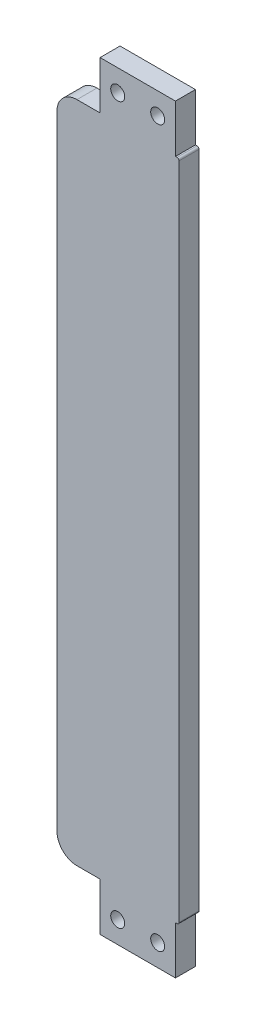
ISO-10303-21;
HEADER;
FILE_DESCRIPTION(('STEP AP214'),'2;1');
FILE_NAME('part.step','',(''),(''),'','','');
FILE_SCHEMA(('AUTOMOTIVE_DESIGN { 1 0 10303 214 1 1 1 1 }'));
ENDSEC;
DATA;
#1=APPLICATION_CONTEXT('core data for automotive mechanical design processes');
#2=APPLICATION_PROTOCOL_DEFINITION('international standard','automotive_design',2000,#1);
#3=PRODUCT_CONTEXT('',#1,'mechanical');
#4=PRODUCT('Part','Part','',(#3));
#5=PRODUCT_RELATED_PRODUCT_CATEGORY('part','',(#4));
#6=PRODUCT_DEFINITION_FORMATION('','',#4);
#7=PRODUCT_DEFINITION_CONTEXT('part definition',#1,'design');
#8=PRODUCT_DEFINITION('design','',#6,#7);
#9=PRODUCT_DEFINITION_SHAPE('','',#8);
#10=(LENGTH_UNIT() NAMED_UNIT(*) SI_UNIT(.MILLI.,.METRE.));
#11=(NAMED_UNIT(*) PLANE_ANGLE_UNIT() SI_UNIT($,.RADIAN.));
#12=(NAMED_UNIT(*) SI_UNIT($,.STERADIAN.) SOLID_ANGLE_UNIT());
#13=UNCERTAINTY_MEASURE_WITH_UNIT(LENGTH_MEASURE(1.E-05),#10,'distance_accuracy_value','');
#14=(GEOMETRIC_REPRESENTATION_CONTEXT(3) GLOBAL_UNCERTAINTY_ASSIGNED_CONTEXT((#13)) GLOBAL_UNIT_ASSIGNED_CONTEXT((#10,
#11,#12)) REPRESENTATION_CONTEXT('',''));
#15=CARTESIAN_POINT('',(0.,0.,0.));
#16=DIRECTION('',(0.,0.,1.));
#17=DIRECTION('',(1.,0.,0.));
#18=AXIS2_PLACEMENT_3D('',#15,#16,#17);
#19=CARTESIAN_POINT('',(9.84658159851318,-15.5,5.));
#20=DIRECTION('',(0.,0.,-1.));
#21=DIRECTION('',(-1.,0.,0.));
#22=AXIS2_PLACEMENT_3D('',#19,#20,#21);
#23=PLANE('',#22);
#24=CARTESIAN_POINT('',(9.84658159851318,-15.5,5.));
#25=DIRECTION('',(0.,0.,1.));
#26=DIRECTION('',(-1.,0.,0.));
#27=AXIS2_PLACEMENT_3D('',#24,#25,#26);
#28=CIRCLE('',#27,0.5);
#29=CARTESIAN_POINT('',(10.3465815985132,-15.5,5.));
#30=VERTEX_POINT('',#29);
#31=CARTESIAN_POINT('',(9.84658159851317,-15.,5.));
#32=VERTEX_POINT('',#31);
#33=EDGE_CURVE('E240',#30,#32,#28,.T.);
#34=ORIENTED_EDGE('',*,*,#33,.T.);
#35=DIRECTION('',(-1.,0.,0.));
#36=VECTOR('',#35,1.);
#37=CARTESIAN_POINT('',(9.44658159851318,-15.,5.));
#38=LINE('',#37,#36);
#39=CARTESIAN_POINT('',(9.44658159851318,-15.,5.));
#40=VERTEX_POINT('',#39);
#41=EDGE_CURVE('E128',#32,#40,#38,.T.);
#42=ORIENTED_EDGE('',*,*,#41,.T.);
#43=DIRECTION('',(0.,1.,0.));
#44=VECTOR('',#43,1.);
#45=CARTESIAN_POINT('',(9.44658159851318,-15.,5.));
#46=LINE('',#45,#44);
#47=CARTESIAN_POINT('',(9.44658159851314,-2.99999999999996,5.));
#48=VERTEX_POINT('',#47);
#49=EDGE_CURVE('E293',#40,#48,#46,.T.);
#50=ORIENTED_EDGE('',*,*,#49,.T.);
#51=DIRECTION('',(-1.,0.,0.));
#52=VECTOR('',#51,1.);
#53=CARTESIAN_POINT('',(9.44658159851314,-2.99999999999996,5.));
#54=LINE('',#53,#52);
#55=CARTESIAN_POINT('',(-9.413759597102,-2.99999999999998,5.));
#56=VERTEX_POINT('',#55);
#57=EDGE_CURVE('E313',#48,#56,#54,.T.);
#58=ORIENTED_EDGE('',*,*,#57,.T.);
#59=DIRECTION('',(0.,-1.,0.));
#60=VECTOR('',#59,1.);
#61=CARTESIAN_POINT('',(-9.413759597102,-2.99999999999998,5.));
#62=LINE('',#61,#60);
#63=CARTESIAN_POINT('',(-9.41375959710199,-15.,5.));
#64=VERTEX_POINT('',#63);
#65=EDGE_CURVE('E309',#56,#64,#62,.T.);
#66=ORIENTED_EDGE('',*,*,#65,.T.);
#67=DIRECTION('',(-1.,0.,0.));
#68=VECTOR('',#67,1.);
#69=CARTESIAN_POINT('',(-9.41375959710199,-15.,5.));
#70=LINE('',#69,#68);
#71=CARTESIAN_POINT('',(-15.1941363117714,-15.,5.));
#72=VERTEX_POINT('',#71);
#73=EDGE_CURVE('E312',#64,#72,#70,.T.);
#74=ORIENTED_EDGE('',*,*,#73,.T.);
#75=CARTESIAN_POINT('',(-15.1941363117714,-20.,5.));
#76=DIRECTION('',(0.,0.,1.));
#77=DIRECTION('',(1.,0.,0.));
#78=AXIS2_PLACEMENT_3D('',#75,#76,#77);
#79=CIRCLE('',#78,5.);
#80=CARTESIAN_POINT('',(-20.1941363117715,-20.,5.));
#81=VERTEX_POINT('',#80);
#82=EDGE_CURVE('E317',#72,#81,#79,.T.);
#83=ORIENTED_EDGE('',*,*,#82,.T.);
#84=DIRECTION('',(0.,-1.,0.));
#85=VECTOR('',#84,1.);
#86=CARTESIAN_POINT('',(-20.1941363117715,-20.,5.));
#87=LINE('',#86,#85);
#88=CARTESIAN_POINT('',(-20.1941363117714,-176.,5.));
#89=VERTEX_POINT('',#88);
#90=EDGE_CURVE('E324',#81,#89,#87,.T.);
#91=ORIENTED_EDGE('',*,*,#90,.T.);
#92=CARTESIAN_POINT('',(-15.1941363117714,-176.,5.));
#93=DIRECTION('',(0.,0.,1.));
#94=DIRECTION('',(-1.,0.,0.));
#95=AXIS2_PLACEMENT_3D('',#92,#93,#94);
#96=CIRCLE('',#95,5.);
#97=CARTESIAN_POINT('',(-15.1941363117714,-181.,5.));
#98=VERTEX_POINT('',#97);
#99=EDGE_CURVE('E327',#89,#98,#96,.T.);
#100=ORIENTED_EDGE('',*,*,#99,.T.);
#101=DIRECTION('',(1.,0.,0.));
#102=VECTOR('',#101,1.);
#103=CARTESIAN_POINT('',(-9.44658159851322,-181.,5.));
#104=LINE('',#103,#102);
#105=CARTESIAN_POINT('',(-9.44658159851322,-181.,5.));
#106=VERTEX_POINT('',#105);
#107=EDGE_CURVE('E330',#98,#106,#104,.T.);
#108=ORIENTED_EDGE('',*,*,#107,.T.);
#109=DIRECTION('',(0.,-1.,0.));
#110=VECTOR('',#109,1.);
#111=CARTESIAN_POINT('',(-9.44658159851322,-181.,5.));
#112=LINE('',#111,#110);
#113=CARTESIAN_POINT('',(-9.44658159851322,-193.,5.));
#114=VERTEX_POINT('',#113);
#115=EDGE_CURVE('E333',#106,#114,#112,.T.);
#116=ORIENTED_EDGE('',*,*,#115,.T.);
#117=DIRECTION('',(1.,0.,0.));
#118=VECTOR('',#117,1.);
#119=CARTESIAN_POINT('',(-9.44658159851322,-193.,5.));
#120=LINE('',#119,#118);
#121=CARTESIAN_POINT('',(9.4465815985132,-193.,5.));
#122=VERTEX_POINT('',#121);
#123=EDGE_CURVE('E336',#114,#122,#120,.T.);
#124=ORIENTED_EDGE('',*,*,#123,.T.);
#125=DIRECTION('',(0.,1.,0.));
#126=VECTOR('',#125,1.);
#127=CARTESIAN_POINT('',(9.4465815985132,-193.,5.));
#128=LINE('',#127,#126);
#129=CARTESIAN_POINT('',(9.4465815985132,-181.,5.));
#130=VERTEX_POINT('',#129);
#131=EDGE_CURVE('E171',#122,#130,#128,.T.);
#132=ORIENTED_EDGE('',*,*,#131,.T.);
#133=DIRECTION('',(1.,0.,0.));
#134=VECTOR('',#133,1.);
#135=CARTESIAN_POINT('',(9.84658159851319,-181.,5.));
#136=LINE('',#135,#134);
#137=CARTESIAN_POINT('',(9.84658159851319,-181.,5.));
#138=VERTEX_POINT('',#137);
#139=EDGE_CURVE('E165',#130,#138,#136,.T.);
#140=ORIENTED_EDGE('',*,*,#139,.T.);
#141=CARTESIAN_POINT('',(9.8465815985132,-180.5,5.));
#142=DIRECTION('',(0.,0.,1.));
#143=DIRECTION('',(-1.,0.,0.));
#144=AXIS2_PLACEMENT_3D('',#141,#142,#143);
#145=CIRCLE('',#144,0.5);
#146=CARTESIAN_POINT('',(10.3465815985132,-180.5,5.));
#147=VERTEX_POINT('',#146);
#148=EDGE_CURVE('E169',#138,#147,#145,.T.);
#149=ORIENTED_EDGE('',*,*,#148,.T.);
#150=DIRECTION('',(0.,1.,0.));
#151=VECTOR('',#150,1.);
#152=CARTESIAN_POINT('',(10.3465815985132,-15.5,5.));
#153=LINE('',#152,#151);
#154=EDGE_CURVE('E61',#147,#30,#153,.T.);
#155=ORIENTED_EDGE('',*,*,#154,.T.);
#156=EDGE_LOOP('',(#34,#42,#50,#58,#66,#74,#83,#91,#100,#108,#116,#124,#132,#140,#149,#155));
#157=FACE_BOUND('',#156,.T.);
#158=CARTESIAN_POINT('',(-4.99999999999996,-8.42970227866071,5.));
#159=DIRECTION('',(0.,0.,1.));
#160=DIRECTION('',(1.,0.,0.));
#161=AXIS2_PLACEMENT_3D('',#158,#159,#160);
#162=CIRCLE('',#161,1.75);
#163=CARTESIAN_POINT('',(-3.24999999999996,-8.42970227866071,5.));
#164=VERTEX_POINT('',#163);
#165=EDGE_CURVE('E198',#164,#164,#162,.T.);
#166=ORIENTED_EDGE('',*,*,#165,.F.);
#167=EDGE_LOOP('',(#166));
#168=FACE_BOUND('',#167,.T.);
#169=CARTESIAN_POINT('',(-5.00000000000012,-187.570297721339,5.));
#170=DIRECTION('',(0.,0.,1.));
#171=DIRECTION('',(1.,0.,0.));
#172=AXIS2_PLACEMENT_3D('',#169,#170,#171);
#173=CIRCLE('',#172,1.75);
#174=CARTESIAN_POINT('',(-3.25000000000012,-187.570297721339,5.));
#175=VERTEX_POINT('',#174);
#176=EDGE_CURVE('E406',#175,#175,#173,.T.);
#177=ORIENTED_EDGE('',*,*,#176,.F.);
#178=EDGE_LOOP('',(#177));
#179=FACE_BOUND('',#178,.T.);
#180=CARTESIAN_POINT('',(5.00000000000004,-8.42970227866071,5.));
#181=DIRECTION('',(0.,0.,1.));
#182=DIRECTION('',(1.,0.,0.));
#183=AXIS2_PLACEMENT_3D('',#180,#181,#182);
#184=CIRCLE('',#183,1.75);
#185=CARTESIAN_POINT('',(6.75000000000004,-8.42970227866071,5.));
#186=VERTEX_POINT('',#185);
#187=EDGE_CURVE('E398',#186,#186,#184,.T.);
#188=ORIENTED_EDGE('',*,*,#187,.F.);
#189=EDGE_LOOP('',(#188));
#190=FACE_BOUND('',#189,.T.);
#191=CARTESIAN_POINT('',(4.99999999999988,-187.570297721339,5.));
#192=DIRECTION('',(0.,0.,1.));
#193=DIRECTION('',(1.,0.,0.));
#194=AXIS2_PLACEMENT_3D('',#191,#192,#193);
#195=CIRCLE('',#194,1.75);
#196=CARTESIAN_POINT('',(6.74999999999988,-187.570297721339,5.));
#197=VERTEX_POINT('',#196);
#198=EDGE_CURVE('E387',#197,#197,#195,.T.);
#199=ORIENTED_EDGE('',*,*,#198,.F.);
#200=EDGE_LOOP('',(#199));
#201=FACE_BOUND('',#200,.T.);
#202=ADVANCED_FACE('F43',(#157,#168,#179,#190,#201),#23,.F.);
#203=CARTESIAN_POINT('',(9.84658159851318,-15.5,0.));
#204=DIRECTION('',(0.,0.,-1.));
#205=DIRECTION('',(-1.,0.,0.));
#206=AXIS2_PLACEMENT_3D('',#203,#204,#205);
#207=PLANE('',#206);
#208=CARTESIAN_POINT('',(5.00000000000004,-8.42970227866071,0.));
#209=DIRECTION('',(0.,0.,1.));
#210=DIRECTION('',(1.,0.,0.));
#211=AXIS2_PLACEMENT_3D('',#208,#209,#210);
#212=CIRCLE('',#211,1.75);
#213=CARTESIAN_POINT('',(6.75000000000004,-8.42970227866071,0.));
#214=VERTEX_POINT('',#213);
#215=EDGE_CURVE('E395',#214,#214,#212,.T.);
#216=ORIENTED_EDGE('',*,*,#215,.T.);
#217=EDGE_LOOP('',(#216));
#218=FACE_BOUND('',#217,.T.);
#219=CARTESIAN_POINT('',(-4.99999999999996,-8.42970227866071,0.));
#220=DIRECTION('',(0.,0.,1.));
#221=DIRECTION('',(1.,0.,0.));
#222=AXIS2_PLACEMENT_3D('',#219,#220,#221);
#223=CIRCLE('',#222,1.75);
#224=CARTESIAN_POINT('',(-3.24999999999996,-8.42970227866071,0.));
#225=VERTEX_POINT('',#224);
#226=EDGE_CURVE('E410',#225,#225,#223,.T.);
#227=ORIENTED_EDGE('',*,*,#226,.T.);
#228=EDGE_LOOP('',(#227));
#229=FACE_BOUND('',#228,.T.);
#230=CARTESIAN_POINT('',(9.84658159851318,-15.5,0.));
#231=DIRECTION('',(0.,0.,1.));
#232=DIRECTION('',(-1.,0.,0.));
#233=AXIS2_PLACEMENT_3D('',#230,#231,#232);
#234=CIRCLE('',#233,0.5);
#235=CARTESIAN_POINT('',(10.3465815985132,-15.5,0.));
#236=VERTEX_POINT('',#235);
#237=CARTESIAN_POINT('',(9.84658159851317,-15.,0.));
#238=VERTEX_POINT('',#237);
#239=EDGE_CURVE('E193',#236,#238,#234,.T.);
#240=ORIENTED_EDGE('',*,*,#239,.F.);
#241=DIRECTION('',(0.,1.,0.));
#242=VECTOR('',#241,1.);
#243=CARTESIAN_POINT('',(10.3465815985132,-15.5,0.));
#244=LINE('',#243,#242);
#245=CARTESIAN_POINT('',(10.3465815985132,-180.5,0.));
#246=VERTEX_POINT('',#245);
#247=EDGE_CURVE('E120',#246,#236,#244,.T.);
#248=ORIENTED_EDGE('',*,*,#247,.F.);
#249=CARTESIAN_POINT('',(9.8465815985132,-180.5,0.));
#250=DIRECTION('',(0.,0.,1.));
#251=DIRECTION('',(-1.,0.,0.));
#252=AXIS2_PLACEMENT_3D('',#249,#250,#251);
#253=CIRCLE('',#252,0.5);
#254=CARTESIAN_POINT('',(9.84658159851319,-181.,0.));
#255=VERTEX_POINT('',#254);
#256=EDGE_CURVE('E114',#255,#246,#253,.T.);
#257=ORIENTED_EDGE('',*,*,#256,.F.);
#258=DIRECTION('',(1.,0.,0.));
#259=VECTOR('',#258,1.);
#260=CARTESIAN_POINT('',(9.84658159851319,-181.,0.));
#261=LINE('',#260,#259);
#262=CARTESIAN_POINT('',(9.4465815985132,-181.,0.));
#263=VERTEX_POINT('',#262);
#264=EDGE_CURVE('E180',#263,#255,#261,.T.);
#265=ORIENTED_EDGE('',*,*,#264,.F.);
#266=DIRECTION('',(0.,1.,0.));
#267=VECTOR('',#266,1.);
#268=CARTESIAN_POINT('',(9.4465815985132,-193.,0.));
#269=LINE('',#268,#267);
#270=CARTESIAN_POINT('',(9.4465815985132,-193.,0.));
#271=VERTEX_POINT('',#270);
#272=EDGE_CURVE('E231',#271,#263,#269,.T.);
#273=ORIENTED_EDGE('',*,*,#272,.F.);
#274=DIRECTION('',(1.,0.,0.));
#275=VECTOR('',#274,1.);
#276=CARTESIAN_POINT('',(-9.44658159851322,-193.,0.));
#277=LINE('',#276,#275);
#278=CARTESIAN_POINT('',(-9.44658159851322,-193.,0.));
#279=VERTEX_POINT('',#278);
#280=EDGE_CURVE('E228',#279,#271,#277,.T.);
#281=ORIENTED_EDGE('',*,*,#280,.F.);
#282=DIRECTION('',(0.,-1.,0.));
#283=VECTOR('',#282,1.);
#284=CARTESIAN_POINT('',(-9.44658159851322,-181.,0.));
#285=LINE('',#284,#283);
#286=CARTESIAN_POINT('',(-9.44658159851322,-181.,0.));
#287=VERTEX_POINT('',#286);
#288=EDGE_CURVE('E225',#287,#279,#285,.T.);
#289=ORIENTED_EDGE('',*,*,#288,.F.);
#290=DIRECTION('',(1.,0.,0.));
#291=VECTOR('',#290,1.);
#292=CARTESIAN_POINT('',(-9.44658159851322,-181.,0.));
#293=LINE('',#292,#291);
#294=CARTESIAN_POINT('',(-15.1941363117714,-181.,0.));
#295=VERTEX_POINT('',#294);
#296=EDGE_CURVE('E222',#295,#287,#293,.T.);
#297=ORIENTED_EDGE('',*,*,#296,.F.);
#298=CARTESIAN_POINT('',(-15.1941363117714,-176.,0.));
#299=DIRECTION('',(0.,0.,1.));
#300=DIRECTION('',(-1.,0.,0.));
#301=AXIS2_PLACEMENT_3D('',#298,#299,#300);
#302=CIRCLE('',#301,5.);
#303=CARTESIAN_POINT('',(-20.1941363117714,-176.,0.));
#304=VERTEX_POINT('',#303);
#305=EDGE_CURVE('E219',#304,#295,#302,.T.);
#306=ORIENTED_EDGE('',*,*,#305,.F.);
#307=DIRECTION('',(0.,-1.,0.));
#308=VECTOR('',#307,1.);
#309=CARTESIAN_POINT('',(-20.1941363117715,-20.,0.));
#310=LINE('',#309,#308);
#311=CARTESIAN_POINT('',(-20.1941363117715,-20.,0.));
#312=VERTEX_POINT('',#311);
#313=EDGE_CURVE('E216',#312,#304,#310,.T.);
#314=ORIENTED_EDGE('',*,*,#313,.F.);
#315=CARTESIAN_POINT('',(-15.1941363117714,-20.,0.));
#316=DIRECTION('',(0.,0.,1.));
#317=DIRECTION('',(1.,0.,0.));
#318=AXIS2_PLACEMENT_3D('',#315,#316,#317);
#319=CIRCLE('',#318,5.);
#320=CARTESIAN_POINT('',(-15.1941363117714,-15.,0.));
#321=VERTEX_POINT('',#320);
#322=EDGE_CURVE('E213',#321,#312,#319,.T.);
#323=ORIENTED_EDGE('',*,*,#322,.F.);
#324=DIRECTION('',(-1.,0.,0.));
#325=VECTOR('',#324,1.);
#326=CARTESIAN_POINT('',(-9.41375959710199,-15.,0.));
#327=LINE('',#326,#325);
#328=CARTESIAN_POINT('',(-9.41375959710199,-15.,0.));
#329=VERTEX_POINT('',#328);
#330=EDGE_CURVE('E210',#329,#321,#327,.T.);
#331=ORIENTED_EDGE('',*,*,#330,.F.);
#332=DIRECTION('',(0.,-1.,0.));
#333=VECTOR('',#332,1.);
#334=CARTESIAN_POINT('',(-9.413759597102,-2.99999999999998,0.));
#335=LINE('',#334,#333);
#336=CARTESIAN_POINT('',(-9.413759597102,-2.99999999999998,0.));
#337=VERTEX_POINT('',#336);
#338=EDGE_CURVE('E207',#337,#329,#335,.T.);
#339=ORIENTED_EDGE('',*,*,#338,.F.);
#340=DIRECTION('',(-1.,0.,0.));
#341=VECTOR('',#340,1.);
#342=CARTESIAN_POINT('',(9.44658159851314,-2.99999999999996,0.));
#343=LINE('',#342,#341);
#344=CARTESIAN_POINT('',(9.44658159851314,-2.99999999999996,0.));
#345=VERTEX_POINT('',#344);
#346=EDGE_CURVE('E204',#345,#337,#343,.T.);
#347=ORIENTED_EDGE('',*,*,#346,.F.);
#348=DIRECTION('',(0.,1.,0.));
#349=VECTOR('',#348,1.);
#350=CARTESIAN_POINT('',(9.44658159851318,-15.,0.));
#351=LINE('',#350,#349);
#352=CARTESIAN_POINT('',(9.44658159851318,-15.,0.));
#353=VERTEX_POINT('',#352);
#354=EDGE_CURVE('E201',#353,#345,#351,.T.);
#355=ORIENTED_EDGE('',*,*,#354,.F.);
#356=DIRECTION('',(-1.,0.,0.));
#357=VECTOR('',#356,1.);
#358=CARTESIAN_POINT('',(9.44658159851318,-15.,0.));
#359=LINE('',#358,#357);
#360=EDGE_CURVE('E197',#238,#353,#359,.T.);
#361=ORIENTED_EDGE('',*,*,#360,.F.);
#362=EDGE_LOOP('',(#240,#248,#257,#265,#273,#281,#289,#297,#306,#314,#323,#331,#339,#347,#355,#361));
#363=FACE_BOUND('',#362,.T.);
#364=CARTESIAN_POINT('',(-5.00000000000012,-187.570297721339,0.));
#365=DIRECTION('',(0.,0.,1.));
#366=DIRECTION('',(1.,0.,0.));
#367=AXIS2_PLACEMENT_3D('',#364,#365,#366);
#368=CIRCLE('',#367,1.75);
#369=CARTESIAN_POINT('',(-3.25000000000012,-187.570297721339,0.));
#370=VERTEX_POINT('',#369);
#371=EDGE_CURVE('E402',#370,#370,#368,.T.);
#372=ORIENTED_EDGE('',*,*,#371,.T.);
#373=EDGE_LOOP('',(#372));
#374=FACE_BOUND('',#373,.T.);
#375=CARTESIAN_POINT('',(4.99999999999988,-187.570297721339,0.));
#376=DIRECTION('',(0.,0.,1.));
#377=DIRECTION('',(1.,0.,0.));
#378=AXIS2_PLACEMENT_3D('',#375,#376,#377);
#379=CIRCLE('',#378,1.75);
#380=CARTESIAN_POINT('',(6.74999999999988,-187.570297721339,0.));
#381=VERTEX_POINT('',#380);
#382=EDGE_CURVE('E390',#381,#381,#379,.T.);
#383=ORIENTED_EDGE('',*,*,#382,.T.);
#384=EDGE_LOOP('',(#383));
#385=FACE_BOUND('',#384,.T.);
#386=ADVANCED_FACE('F297',(#218,#229,#363,#374,#385),#207,.T.);
#387=CARTESIAN_POINT('',(9.84658159851318,-15.5,5.));
#388=DIRECTION('',(0.,0.,-1.));
#389=DIRECTION('',(-1.,0.,0.));
#390=AXIS2_PLACEMENT_3D('',#387,#388,#389);
#391=CYLINDRICAL_SURFACE('',#390,0.5);
#392=ORIENTED_EDGE('',*,*,#239,.T.);
#393=DIRECTION('',(0.,0.,-1.));
#394=VECTOR('',#393,1.);
#395=CARTESIAN_POINT('',(9.84658159851317,-15.,5.));
#396=LINE('',#395,#394);
#397=EDGE_CURVE('E11',#32,#238,#396,.T.);
#398=ORIENTED_EDGE('',*,*,#397,.F.);
#399=ORIENTED_EDGE('',*,*,#33,.F.);
#400=DIRECTION('',(0.,0.,-1.));
#401=VECTOR('',#400,1.);
#402=CARTESIAN_POINT('',(10.3465815985132,-15.5,5.));
#403=LINE('',#402,#401);
#404=EDGE_CURVE('E189',#30,#236,#403,.T.);
#405=ORIENTED_EDGE('',*,*,#404,.T.);
#406=EDGE_LOOP('',(#392,#398,#399,#405));
#407=FACE_BOUND('',#406,.T.);
#408=ADVANCED_FACE('F45',(#407),#391,.T.);
#409=CARTESIAN_POINT('',(9.44658159851318,-15.,5.));
#410=DIRECTION('',(0.,-1.,0.));
#411=DIRECTION('',(0.,0.,-1.));
#412=AXIS2_PLACEMENT_3D('',#409,#410,#411);
#413=PLANE('',#412);
#414=ORIENTED_EDGE('',*,*,#360,.T.);
#415=DIRECTION('',(0.,0.,-1.));
#416=VECTOR('',#415,1.);
#417=CARTESIAN_POINT('',(9.44658159851318,-15.,5.));
#418=LINE('',#417,#416);
#419=EDGE_CURVE('E53',#40,#353,#418,.T.);
#420=ORIENTED_EDGE('',*,*,#419,.F.);
#421=ORIENTED_EDGE('',*,*,#41,.F.);
#422=ORIENTED_EDGE('',*,*,#397,.T.);
#423=EDGE_LOOP('',(#414,#420,#421,#422));
#424=FACE_BOUND('',#423,.T.);
#425=ADVANCED_FACE('F582',(#424),#413,.F.);
#426=CARTESIAN_POINT('',(9.44658159851318,-15.,5.));
#427=DIRECTION('',(-1.,0.,0.));
#428=DIRECTION('',(0.,-1.,0.));
#429=AXIS2_PLACEMENT_3D('',#426,#427,#428);
#430=PLANE('',#429);
#431=ORIENTED_EDGE('',*,*,#354,.T.);
#432=DIRECTION('',(0.,0.,-1.));
#433=VECTOR('',#432,1.);
#434=CARTESIAN_POINT('',(9.44658159851314,-2.99999999999996,5.));
#435=LINE('',#434,#433);
#436=EDGE_CURVE('E283',#48,#345,#435,.T.);
#437=ORIENTED_EDGE('',*,*,#436,.F.);
#438=ORIENTED_EDGE('',*,*,#49,.F.);
#439=ORIENTED_EDGE('',*,*,#419,.T.);
#440=EDGE_LOOP('',(#431,#437,#438,#439));
#441=FACE_BOUND('',#440,.T.);
#442=ADVANCED_FACE('F291',(#441),#430,.F.);
#443=CARTESIAN_POINT('',(9.44658159851314,-2.99999999999996,5.));
#444=DIRECTION('',(0.,-1.,0.));
#445=DIRECTION('',(1.,0.,0.));
#446=AXIS2_PLACEMENT_3D('',#443,#444,#445);
#447=PLANE('',#446);
#448=ORIENTED_EDGE('',*,*,#346,.T.);
#449=DIRECTION('',(0.,0.,-1.));
#450=VECTOR('',#449,1.);
#451=CARTESIAN_POINT('',(-9.413759597102,-2.99999999999998,5.));
#452=LINE('',#451,#450);
#453=EDGE_CURVE('E279',#56,#337,#452,.T.);
#454=ORIENTED_EDGE('',*,*,#453,.F.);
#455=ORIENTED_EDGE('',*,*,#57,.F.);
#456=ORIENTED_EDGE('',*,*,#436,.T.);
#457=EDGE_LOOP('',(#448,#454,#455,#456));
#458=FACE_BOUND('',#457,.T.);
#459=ADVANCED_FACE('F303',(#458),#447,.F.);
#460=CARTESIAN_POINT('',(-9.413759597102,-2.99999999999998,5.));
#461=DIRECTION('',(1.,0.,0.));
#462=DIRECTION('',(0.,1.,0.));
#463=AXIS2_PLACEMENT_3D('',#460,#461,#462);
#464=PLANE('',#463);
#465=ORIENTED_EDGE('',*,*,#338,.T.);
#466=DIRECTION('',(0.,0.,-1.));
#467=VECTOR('',#466,1.);
#468=CARTESIAN_POINT('',(-9.41375959710199,-15.,5.));
#469=LINE('',#468,#467);
#470=EDGE_CURVE('E275',#64,#329,#469,.T.);
#471=ORIENTED_EDGE('',*,*,#470,.F.);
#472=ORIENTED_EDGE('',*,*,#65,.F.);
#473=ORIENTED_EDGE('',*,*,#453,.T.);
#474=EDGE_LOOP('',(#465,#471,#472,#473));
#475=FACE_BOUND('',#474,.T.);
#476=ADVANCED_FACE('F307',(#475),#464,.F.);
#477=CARTESIAN_POINT('',(-9.41375959710199,-15.,5.));
#478=DIRECTION('',(0.,-1.,0.));
#479=DIRECTION('',(0.,0.,-1.));
#480=AXIS2_PLACEMENT_3D('',#477,#478,#479);
#481=PLANE('',#480);
#482=ORIENTED_EDGE('',*,*,#330,.T.);
#483=DIRECTION('',(0.,0.,-1.));
#484=VECTOR('',#483,1.);
#485=CARTESIAN_POINT('',(-15.1941363117714,-15.,5.));
#486=LINE('',#485,#484);
#487=EDGE_CURVE('E271',#72,#321,#486,.T.);
#488=ORIENTED_EDGE('',*,*,#487,.F.);
#489=ORIENTED_EDGE('',*,*,#73,.F.);
#490=ORIENTED_EDGE('',*,*,#470,.T.);
#491=EDGE_LOOP('',(#482,#488,#489,#490));
#492=FACE_BOUND('',#491,.T.);
#493=ADVANCED_FACE('F543',(#492),#481,.F.);
#494=CARTESIAN_POINT('',(-15.1941363117714,-20.,5.));
#495=DIRECTION('',(0.,0.,-1.));
#496=DIRECTION('',(-1.,0.,0.));
#497=AXIS2_PLACEMENT_3D('',#494,#495,#496);
#498=CYLINDRICAL_SURFACE('',#497,5.);
#499=ORIENTED_EDGE('',*,*,#322,.T.);
#500=DIRECTION('',(0.,0.,-1.));
#501=VECTOR('',#500,1.);
#502=CARTESIAN_POINT('',(-20.1941363117715,-20.,5.));
#503=LINE('',#502,#501);
#504=EDGE_CURVE('E267',#81,#312,#503,.T.);
#505=ORIENTED_EDGE('',*,*,#504,.F.);
#506=ORIENTED_EDGE('',*,*,#82,.F.);
#507=ORIENTED_EDGE('',*,*,#487,.T.);
#508=EDGE_LOOP('',(#499,#505,#506,#507));
#509=FACE_BOUND('',#508,.T.);
#510=ADVANCED_FACE('F532',(#509),#498,.T.);
#511=CARTESIAN_POINT('',(-20.1941363117715,-20.,5.));
#512=DIRECTION('',(1.,0.,0.));
#513=DIRECTION('',(0.,1.,0.));
#514=AXIS2_PLACEMENT_3D('',#511,#512,#513);
#515=PLANE('',#514);
#516=ORIENTED_EDGE('',*,*,#313,.T.);
#517=DIRECTION('',(0.,0.,-1.));
#518=VECTOR('',#517,1.);
#519=CARTESIAN_POINT('',(-20.1941363117714,-176.,5.));
#520=LINE('',#519,#518);
#521=EDGE_CURVE('E263',#89,#304,#520,.T.);
#522=ORIENTED_EDGE('',*,*,#521,.F.);
#523=ORIENTED_EDGE('',*,*,#90,.F.);
#524=ORIENTED_EDGE('',*,*,#504,.T.);
#525=EDGE_LOOP('',(#516,#522,#523,#524));
#526=FACE_BOUND('',#525,.T.);
#527=ADVANCED_FACE('F521',(#526),#515,.F.);
#528=CARTESIAN_POINT('',(-15.1941363117714,-176.,5.));
#529=DIRECTION('',(0.,0.,-1.));
#530=DIRECTION('',(-1.,0.,0.));
#531=AXIS2_PLACEMENT_3D('',#528,#529,#530);
#532=CYLINDRICAL_SURFACE('',#531,5.);
#533=ORIENTED_EDGE('',*,*,#305,.T.);
#534=DIRECTION('',(0.,0.,-1.));
#535=VECTOR('',#534,1.);
#536=CARTESIAN_POINT('',(-15.1941363117714,-181.,5.));
#537=LINE('',#536,#535);
#538=EDGE_CURVE('E259',#98,#295,#537,.T.);
#539=ORIENTED_EDGE('',*,*,#538,.F.);
#540=ORIENTED_EDGE('',*,*,#99,.F.);
#541=ORIENTED_EDGE('',*,*,#521,.T.);
#542=EDGE_LOOP('',(#533,#539,#540,#541));
#543=FACE_BOUND('',#542,.T.);
#544=ADVANCED_FACE('F510',(#543),#532,.T.);
#545=CARTESIAN_POINT('',(-9.44658159851322,-181.,5.));
#546=DIRECTION('',(0.,1.,0.));
#547=DIRECTION('',(-1.,0.,0.));
#548=AXIS2_PLACEMENT_3D('',#545,#546,#547);
#549=PLANE('',#548);
#550=ORIENTED_EDGE('',*,*,#296,.T.);
#551=DIRECTION('',(0.,0.,-1.));
#552=VECTOR('',#551,1.);
#553=CARTESIAN_POINT('',(-9.44658159851322,-181.,5.));
#554=LINE('',#553,#552);
#555=EDGE_CURVE('E255',#106,#287,#554,.T.);
#556=ORIENTED_EDGE('',*,*,#555,.F.);
#557=ORIENTED_EDGE('',*,*,#107,.F.);
#558=ORIENTED_EDGE('',*,*,#538,.T.);
#559=EDGE_LOOP('',(#550,#556,#557,#558));
#560=FACE_BOUND('',#559,.T.);
#561=ADVANCED_FACE('F499',(#560),#549,.F.);
#562=CARTESIAN_POINT('',(-9.44658159851322,-181.,5.));
#563=DIRECTION('',(1.,0.,0.));
#564=DIRECTION('',(0.,1.,0.));
#565=AXIS2_PLACEMENT_3D('',#562,#563,#564);
#566=PLANE('',#565);
#567=ORIENTED_EDGE('',*,*,#288,.T.);
#568=DIRECTION('',(0.,0.,-1.));
#569=VECTOR('',#568,1.);
#570=CARTESIAN_POINT('',(-9.44658159851322,-193.,5.));
#571=LINE('',#570,#569);
#572=EDGE_CURVE('E251',#114,#279,#571,.T.);
#573=ORIENTED_EDGE('',*,*,#572,.F.);
#574=ORIENTED_EDGE('',*,*,#115,.F.);
#575=ORIENTED_EDGE('',*,*,#555,.T.);
#576=EDGE_LOOP('',(#567,#573,#574,#575));
#577=FACE_BOUND('',#576,.T.);
#578=ADVANCED_FACE('F489',(#577),#566,.F.);
#579=CARTESIAN_POINT('',(-9.44658159851322,-193.,5.));
#580=DIRECTION('',(0.,1.,0.));
#581=DIRECTION('',(0.,0.,1.));
#582=AXIS2_PLACEMENT_3D('',#579,#580,#581);
#583=PLANE('',#582);
#584=ORIENTED_EDGE('',*,*,#280,.T.);
#585=DIRECTION('',(0.,0.,-1.));
#586=VECTOR('',#585,1.);
#587=CARTESIAN_POINT('',(9.4465815985132,-193.,5.));
#588=LINE('',#587,#586);
#589=EDGE_CURVE('E247',#122,#271,#588,.T.);
#590=ORIENTED_EDGE('',*,*,#589,.F.);
#591=ORIENTED_EDGE('',*,*,#123,.F.);
#592=ORIENTED_EDGE('',*,*,#572,.T.);
#593=EDGE_LOOP('',(#584,#590,#591,#592));
#594=FACE_BOUND('',#593,.T.);
#595=ADVANCED_FACE('F344',(#594),#583,.F.);
#596=CARTESIAN_POINT('',(9.4465815985132,-193.,5.));
#597=DIRECTION('',(-1.,0.,0.));
#598=DIRECTION('',(0.,-1.,0.));
#599=AXIS2_PLACEMENT_3D('',#596,#597,#598);
#600=PLANE('',#599);
#601=ORIENTED_EDGE('',*,*,#272,.T.);
#602=DIRECTION('',(0.,0.,-1.));
#603=VECTOR('',#602,1.);
#604=CARTESIAN_POINT('',(9.4465815985132,-181.,5.));
#605=LINE('',#604,#603);
#606=EDGE_CURVE('E182',#130,#263,#605,.T.);
#607=ORIENTED_EDGE('',*,*,#606,.F.);
#608=ORIENTED_EDGE('',*,*,#131,.F.);
#609=ORIENTED_EDGE('',*,*,#589,.T.);
#610=EDGE_LOOP('',(#601,#607,#608,#609));
#611=FACE_BOUND('',#610,.T.);
#612=ADVANCED_FACE('F348',(#611),#600,.F.);
#613=CARTESIAN_POINT('',(9.84658159851319,-181.,5.));
#614=DIRECTION('',(0.,1.,0.));
#615=DIRECTION('',(0.,0.,1.));
#616=AXIS2_PLACEMENT_3D('',#613,#614,#615);
#617=PLANE('',#616);
#618=ORIENTED_EDGE('',*,*,#264,.T.);
#619=DIRECTION('',(0.,0.,-1.));
#620=VECTOR('',#619,1.);
#621=CARTESIAN_POINT('',(9.84658159851319,-181.,5.));
#622=LINE('',#621,#620);
#623=EDGE_CURVE('E177',#138,#255,#622,.T.);
#624=ORIENTED_EDGE('',*,*,#623,.F.);
#625=ORIENTED_EDGE('',*,*,#139,.F.);
#626=ORIENTED_EDGE('',*,*,#606,.T.);
#627=EDGE_LOOP('',(#618,#624,#625,#626));
#628=FACE_BOUND('',#627,.T.);
#629=ADVANCED_FACE('F178',(#628),#617,.F.);
#630=CARTESIAN_POINT('',(9.8465815985132,-180.5,5.));
#631=DIRECTION('',(0.,0.,-1.));
#632=DIRECTION('',(-1.,0.,0.));
#633=AXIS2_PLACEMENT_3D('',#630,#631,#632);
#634=CYLINDRICAL_SURFACE('',#633,0.5);
#635=ORIENTED_EDGE('',*,*,#256,.T.);
#636=DIRECTION('',(0.,0.,-1.));
#637=VECTOR('',#636,1.);
#638=CARTESIAN_POINT('',(10.3465815985132,-180.5,5.));
#639=LINE('',#638,#637);
#640=EDGE_CURVE('E183',#147,#246,#639,.T.);
#641=ORIENTED_EDGE('',*,*,#640,.F.);
#642=ORIENTED_EDGE('',*,*,#148,.F.);
#643=ORIENTED_EDGE('',*,*,#623,.T.);
#644=EDGE_LOOP('',(#635,#641,#642,#643));
#645=FACE_BOUND('',#644,.T.);
#646=ADVANCED_FACE('F185',(#645),#634,.T.);
#647=CARTESIAN_POINT('',(10.3465815985132,-15.5,5.));
#648=DIRECTION('',(-1.,0.,0.));
#649=DIRECTION('',(0.,-1.,0.));
#650=AXIS2_PLACEMENT_3D('',#647,#648,#649);
#651=PLANE('',#650);
#652=ORIENTED_EDGE('',*,*,#247,.T.);
#653=ORIENTED_EDGE('',*,*,#404,.F.);
#654=ORIENTED_EDGE('',*,*,#154,.F.);
#655=ORIENTED_EDGE('',*,*,#640,.T.);
#656=EDGE_LOOP('',(#652,#653,#654,#655));
#657=FACE_BOUND('',#656,.T.);
#658=ADVANCED_FACE('F352',(#657),#651,.F.);
#659=CARTESIAN_POINT('',(-4.99999999999996,-8.42970227866071,5.));
#660=DIRECTION('',(0.,0.,-1.));
#661=DIRECTION('',(-1.,0.,0.));
#662=AXIS2_PLACEMENT_3D('',#659,#660,#661);
#663=CYLINDRICAL_SURFACE('',#662,1.75);
#664=ORIENTED_EDGE('',*,*,#165,.T.);
#665=EDGE_LOOP('',(#664));
#666=FACE_BOUND('',#665,.T.);
#667=ORIENTED_EDGE('',*,*,#226,.F.);
#668=EDGE_LOOP('',(#667));
#669=FACE_BOUND('',#668,.T.);
#670=ADVANCED_FACE('F354',(#666,#669),#663,.F.);
#671=CARTESIAN_POINT('',(-5.00000000000012,-187.570297721339,5.));
#672=DIRECTION('',(0.,0.,-1.));
#673=DIRECTION('',(-1.,0.,0.));
#674=AXIS2_PLACEMENT_3D('',#671,#672,#673);
#675=CYLINDRICAL_SURFACE('',#674,1.75);
#676=ORIENTED_EDGE('',*,*,#176,.T.);
#677=EDGE_LOOP('',(#676));
#678=FACE_BOUND('',#677,.T.);
#679=ORIENTED_EDGE('',*,*,#371,.F.);
#680=EDGE_LOOP('',(#679));
#681=FACE_BOUND('',#680,.T.);
#682=ADVANCED_FACE('F360',(#678,#681),#675,.F.);
#683=CARTESIAN_POINT('',(5.00000000000004,-8.42970227866071,5.));
#684=DIRECTION('',(0.,0.,-1.));
#685=DIRECTION('',(-1.,0.,0.));
#686=AXIS2_PLACEMENT_3D('',#683,#684,#685);
#687=CYLINDRICAL_SURFACE('',#686,1.75);
#688=ORIENTED_EDGE('',*,*,#187,.T.);
#689=EDGE_LOOP('',(#688));
#690=FACE_BOUND('',#689,.T.);
#691=ORIENTED_EDGE('',*,*,#215,.F.);
#692=EDGE_LOOP('',(#691));
#693=FACE_BOUND('',#692,.T.);
#694=ADVANCED_FACE('F374',(#690,#693),#687,.F.);
#695=CARTESIAN_POINT('',(4.99999999999988,-187.570297721339,5.));
#696=DIRECTION('',(0.,0.,-1.));
#697=DIRECTION('',(-1.,0.,0.));
#698=AXIS2_PLACEMENT_3D('',#695,#696,#697);
#699=CYLINDRICAL_SURFACE('',#698,1.75);
#700=ORIENTED_EDGE('',*,*,#198,.T.);
#701=EDGE_LOOP('',(#700));
#702=FACE_BOUND('',#701,.T.);
#703=ORIENTED_EDGE('',*,*,#382,.F.);
#704=EDGE_LOOP('',(#703));
#705=FACE_BOUND('',#704,.T.);
#706=ADVANCED_FACE('F378',(#702,#705),#699,.F.);
#707=CLOSED_SHELL('',(#202,#386,#408,#425,#442,#459,#476,#493,#510,#527,#544,#561,#578,#595,
#612,#629,#646,#658,#670,#682,#694,#706));
#708=MANIFOLD_SOLID_BREP('B2',#707);
#709=ADVANCED_BREP_SHAPE_REPRESENTATION('',(#18,#708),#14);
#710=SHAPE_DEFINITION_REPRESENTATION(#9,#709);
ENDSEC;
END-ISO-10303-21;
